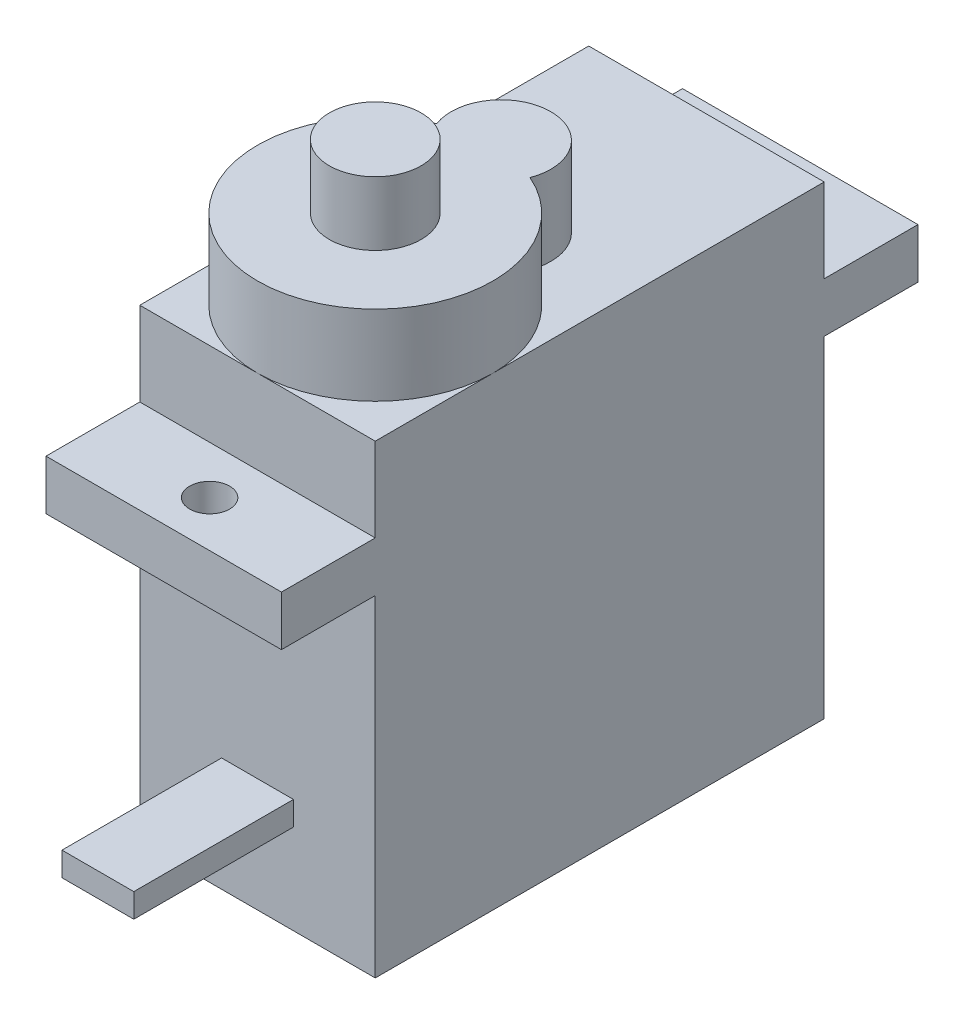
ISO-10303-21;
HEADER;
FILE_DESCRIPTION(('STEP AP214'),'2;1');
FILE_NAME('part.step','',(''),(''),'','','');
FILE_SCHEMA(('AUTOMOTIVE_DESIGN { 1 0 10303 214 1 1 1 1 }'));
ENDSEC;
DATA;
#1=APPLICATION_CONTEXT('core data for automotive mechanical design processes');
#2=APPLICATION_PROTOCOL_DEFINITION('international standard','automotive_design',2000,#1);
#3=PRODUCT_CONTEXT('',#1,'mechanical');
#4=PRODUCT('Part','Part','',(#3));
#5=PRODUCT_RELATED_PRODUCT_CATEGORY('part','',(#4));
#6=PRODUCT_DEFINITION_FORMATION('','',#4);
#7=PRODUCT_DEFINITION_CONTEXT('part definition',#1,'design');
#8=PRODUCT_DEFINITION('design','',#6,#7);
#9=PRODUCT_DEFINITION_SHAPE('','',#8);
#10=(LENGTH_UNIT() NAMED_UNIT(*) SI_UNIT(.MILLI.,.METRE.));
#11=(NAMED_UNIT(*) PLANE_ANGLE_UNIT() SI_UNIT($,.RADIAN.));
#12=(NAMED_UNIT(*) SI_UNIT($,.STERADIAN.) SOLID_ANGLE_UNIT());
#13=UNCERTAINTY_MEASURE_WITH_UNIT(LENGTH_MEASURE(1.E-05),#10,'distance_accuracy_value','');
#14=(GEOMETRIC_REPRESENTATION_CONTEXT(3) GLOBAL_UNCERTAINTY_ASSIGNED_CONTEXT((#13)) GLOBAL_UNIT_ASSIGNED_CONTEXT((#10,
#11,#12)) REPRESENTATION_CONTEXT('',''));
#15=CARTESIAN_POINT('',(0.,0.,0.));
#16=DIRECTION('',(0.,0.,1.));
#17=DIRECTION('',(1.,0.,0.));
#18=AXIS2_PLACEMENT_3D('',#15,#16,#17);
#19=CARTESIAN_POINT('',(-5.9,23.3,11.25));
#20=DIRECTION('',(0.,0.,-1.));
#21=DIRECTION('',(-1.,0.,0.));
#22=AXIS2_PLACEMENT_3D('',#19,#20,#21);
#23=PLANE('',#22);
#24=DIRECTION('',(1.,0.,0.));
#25=VECTOR('',#24,1.);
#26=CARTESIAN_POINT('',(-5.9,16.6,11.25));
#27=LINE('',#26,#25);
#28=CARTESIAN_POINT('',(-5.9,16.6,11.25));
#29=VERTEX_POINT('',#28);
#30=CARTESIAN_POINT('',(5.9,16.6,11.25));
#31=VERTEX_POINT('',#30);
#32=EDGE_CURVE('E322',#29,#31,#27,.T.);
#33=ORIENTED_EDGE('',*,*,#32,.F.);
#34=DIRECTION('',(0.,-1.,0.));
#35=VECTOR('',#34,1.);
#36=CARTESIAN_POINT('',(-5.9,23.3,11.25));
#37=LINE('',#36,#35);
#38=CARTESIAN_POINT('',(-5.9,0.,11.25));
#39=VERTEX_POINT('',#38);
#40=EDGE_CURVE('E312',#29,#39,#37,.T.);
#41=ORIENTED_EDGE('',*,*,#40,.T.);
#42=DIRECTION('',(1.,0.,0.));
#43=VECTOR('',#42,1.);
#44=CARTESIAN_POINT('',(-5.9,0.,11.25));
#45=LINE('',#44,#43);
#46=CARTESIAN_POINT('',(5.9,0.,11.25));
#47=VERTEX_POINT('',#46);
#48=EDGE_CURVE('E306',#39,#47,#45,.T.);
#49=ORIENTED_EDGE('',*,*,#48,.T.);
#50=DIRECTION('',(0.,-1.,0.));
#51=VECTOR('',#50,1.);
#52=CARTESIAN_POINT('',(5.9,23.3,11.25));
#53=LINE('',#52,#51);
#54=EDGE_CURVE('E297',#31,#47,#53,.T.);
#55=ORIENTED_EDGE('',*,*,#54,.F.);
#56=EDGE_LOOP('',(#33,#41,#49,#55));
#57=FACE_BOUND('',#56,.T.);
#58=DIRECTION('',(0.,1.,0.));
#59=VECTOR('',#58,1.);
#60=CARTESIAN_POINT('',(1.8,5.7,11.25));
#61=LINE('',#60,#59);
#62=CARTESIAN_POINT('',(1.8,4.5,11.25));
#63=VERTEX_POINT('',#62);
#64=CARTESIAN_POINT('',(1.8,5.7,11.25));
#65=VERTEX_POINT('',#64);
#66=EDGE_CURVE('E201',#63,#65,#61,.T.);
#67=ORIENTED_EDGE('',*,*,#66,.F.);
#68=DIRECTION('',(1.,0.,0.));
#69=VECTOR('',#68,1.);
#70=CARTESIAN_POINT('',(-1.8,4.5,11.25));
#71=LINE('',#70,#69);
#72=CARTESIAN_POINT('',(-1.8,4.5,11.25));
#73=VERTEX_POINT('',#72);
#74=EDGE_CURVE('E198',#73,#63,#71,.T.);
#75=ORIENTED_EDGE('',*,*,#74,.F.);
#76=DIRECTION('',(0.,-1.,0.));
#77=VECTOR('',#76,1.);
#78=CARTESIAN_POINT('',(-1.8,5.7,11.25));
#79=LINE('',#78,#77);
#80=CARTESIAN_POINT('',(-1.8,5.7,11.25));
#81=VERTEX_POINT('',#80);
#82=EDGE_CURVE('E67',#81,#73,#79,.T.);
#83=ORIENTED_EDGE('',*,*,#82,.F.);
#84=DIRECTION('',(-1.,0.,0.));
#85=VECTOR('',#84,1.);
#86=CARTESIAN_POINT('',(-1.8,5.7,11.25));
#87=LINE('',#86,#85);
#88=EDGE_CURVE('E62',#65,#81,#87,.T.);
#89=ORIENTED_EDGE('',*,*,#88,.F.);
#90=EDGE_LOOP('',(#67,#75,#83,#89));
#91=FACE_BOUND('',#90,.T.);
#92=ADVANCED_FACE('F44',(#57,#91),#23,.F.);
#93=CARTESIAN_POINT('',(0.,27.3,0.));
#94=DIRECTION('',(0.,1.,0.));
#95=DIRECTION('',(0.,0.,1.));
#96=AXIS2_PLACEMENT_3D('',#93,#94,#95);
#97=PLANE('',#96);
#98=CARTESIAN_POINT('',(0.,27.3,5.35));
#99=DIRECTION('',(0.,1.,0.));
#100=DIRECTION('',(0.,0.,1.));
#101=AXIS2_PLACEMENT_3D('',#98,#99,#100);
#102=CIRCLE('',#101,5.9);
#103=CARTESIAN_POINT('',(-2.3387437273507,27.3,-0.0666666666666706));
#104=VERTEX_POINT('',#103);
#105=CARTESIAN_POINT('',(2.3387437273507,27.3,-0.0666666666666706));
#106=VERTEX_POINT('',#105);
#107=EDGE_CURVE('E214',#104,#106,#102,.T.);
#108=ORIENTED_EDGE('',*,*,#107,.T.);
#109=CARTESIAN_POINT('',(0.,27.3,-0.950000000000002));
#110=DIRECTION('',(0.,1.,0.));
#111=DIRECTION('',(0.,0.,1.));
#112=AXIS2_PLACEMENT_3D('',#109,#110,#111);
#113=CIRCLE('',#112,2.5);
#114=EDGE_CURVE('E219',#106,#104,#113,.T.);
#115=ORIENTED_EDGE('',*,*,#114,.T.);
#116=EDGE_LOOP('',(#108,#115));
#117=FACE_BOUND('',#116,.T.);
#118=CARTESIAN_POINT('',(0.,27.3,5.35));
#119=DIRECTION('',(0.,1.,0.));
#120=DIRECTION('',(0.,0.,1.));
#121=AXIS2_PLACEMENT_3D('',#118,#119,#120);
#122=CIRCLE('',#121,2.3);
#123=CARTESIAN_POINT('',(0.,27.3,7.65));
#124=VERTEX_POINT('',#123);
#125=EDGE_CURVE('E202',#124,#124,#122,.T.);
#126=ORIENTED_EDGE('',*,*,#125,.F.);
#127=EDGE_LOOP('',(#126));
#128=FACE_BOUND('',#127,.T.);
#129=ADVANCED_FACE('F371',(#117,#128),#97,.T.);
#130=CARTESIAN_POINT('',(0.,23.3,0.));
#131=DIRECTION('',(0.,1.,0.));
#132=DIRECTION('',(0.,0.,1.));
#133=AXIS2_PLACEMENT_3D('',#130,#131,#132);
#134=PLANE('',#133);
#135=CARTESIAN_POINT('',(0.,23.3,5.35));
#136=DIRECTION('',(0.,1.,0.));
#137=DIRECTION('',(0.,0.,1.));
#138=AXIS2_PLACEMENT_3D('',#135,#136,#137);
#139=CIRCLE('',#138,5.9);
#140=CARTESIAN_POINT('',(-2.3387437273507,23.3,-0.0666666666666706));
#141=VERTEX_POINT('',#140);
#142=CARTESIAN_POINT('',(-5.9,23.3,5.35));
#143=VERTEX_POINT('',#142);
#144=EDGE_CURVE('E55',#141,#143,#139,.T.);
#145=ORIENTED_EDGE('',*,*,#144,.F.);
#146=CARTESIAN_POINT('',(0.,23.3,-0.950000000000002));
#147=DIRECTION('',(0.,1.,0.));
#148=DIRECTION('',(0.,0.,1.));
#149=AXIS2_PLACEMENT_3D('',#146,#147,#148);
#150=CIRCLE('',#149,2.5);
#151=CARTESIAN_POINT('',(2.3387437273507,23.3,-0.0666666666666706));
#152=VERTEX_POINT('',#151);
#153=EDGE_CURVE('E212',#152,#141,#150,.T.);
#154=ORIENTED_EDGE('',*,*,#153,.F.);
#155=CARTESIAN_POINT('',(5.9,23.3,5.35));
#156=VERTEX_POINT('',#155);
#157=EDGE_CURVE('E220',#156,#152,#139,.T.);
#158=ORIENTED_EDGE('',*,*,#157,.F.);
#159=DIRECTION('',(0.,0.,-1.));
#160=VECTOR('',#159,1.);
#161=CARTESIAN_POINT('',(5.9,23.3,-11.25));
#162=LINE('',#161,#160);
#163=CARTESIAN_POINT('',(5.9,23.3,-11.25));
#164=VERTEX_POINT('',#163);
#165=EDGE_CURVE('E287',#156,#164,#162,.T.);
#166=ORIENTED_EDGE('',*,*,#165,.T.);
#167=DIRECTION('',(-1.,0.,0.));
#168=VECTOR('',#167,1.);
#169=CARTESIAN_POINT('',(-5.9,23.3,-11.25));
#170=LINE('',#169,#168);
#171=CARTESIAN_POINT('',(-5.9,23.3,-11.25));
#172=VERTEX_POINT('',#171);
#173=EDGE_CURVE('E286',#164,#172,#170,.T.);
#174=ORIENTED_EDGE('',*,*,#173,.T.);
#175=DIRECTION('',(0.,0.,1.));
#176=VECTOR('',#175,1.);
#177=CARTESIAN_POINT('',(-5.9,23.3,-11.25));
#178=LINE('',#177,#176);
#179=EDGE_CURVE('E290',#172,#143,#178,.T.);
#180=ORIENTED_EDGE('',*,*,#179,.T.);
#181=EDGE_LOOP('',(#145,#154,#158,#166,#174,#180));
#182=FACE_BOUND('',#181,.T.);
#183=ADVANCED_FACE('F361',(#182),#134,.T.);
#184=CARTESIAN_POINT('',(0.,23.3,11.25));
#185=VERTEX_POINT('',#184);
#186=EDGE_CURVE('E12',#143,#185,#139,.T.);
#187=ORIENTED_EDGE('',*,*,#186,.F.);
#188=CARTESIAN_POINT('',(-5.9,23.3,11.25));
#189=VERTEX_POINT('',#188);
#190=EDGE_CURVE('E289',#143,#189,#178,.T.);
#191=ORIENTED_EDGE('',*,*,#190,.T.);
#192=DIRECTION('',(1.,0.,0.));
#193=VECTOR('',#192,1.);
#194=CARTESIAN_POINT('',(-5.9,23.3,11.25));
#195=LINE('',#194,#193);
#196=EDGE_CURVE('E294',#189,#185,#195,.T.);
#197=ORIENTED_EDGE('',*,*,#196,.T.);
#198=EDGE_LOOP('',(#187,#191,#197));
#199=FACE_BOUND('',#198,.T.);
#200=ADVANCED_FACE('F342',(#199),#134,.T.);
#201=CARTESIAN_POINT('',(-5.9,23.3,-11.25));
#202=DIRECTION('',(0.,0.,1.));
#203=DIRECTION('',(1.,0.,0.));
#204=AXIS2_PLACEMENT_3D('',#201,#202,#203);
#205=PLANE('',#204);
#206=DIRECTION('',(-1.,0.,0.));
#207=VECTOR('',#206,1.);
#208=CARTESIAN_POINT('',(-5.9,16.6,-11.25));
#209=LINE('',#208,#207);
#210=CARTESIAN_POINT('',(5.9,16.6,-11.25));
#211=VERTEX_POINT('',#210);
#212=CARTESIAN_POINT('',(-5.9,16.6,-11.25));
#213=VERTEX_POINT('',#212);
#214=EDGE_CURVE('E276',#211,#213,#209,.T.);
#215=ORIENTED_EDGE('',*,*,#214,.F.);
#216=DIRECTION('',(0.,-1.,0.));
#217=VECTOR('',#216,1.);
#218=CARTESIAN_POINT('',(5.9,23.3,-11.25));
#219=LINE('',#218,#217);
#220=CARTESIAN_POINT('',(5.9,0.,-11.25));
#221=VERTEX_POINT('',#220);
#222=EDGE_CURVE('E319',#211,#221,#219,.T.);
#223=ORIENTED_EDGE('',*,*,#222,.T.);
#224=DIRECTION('',(-1.,0.,0.));
#225=VECTOR('',#224,1.);
#226=CARTESIAN_POINT('',(-5.9,0.,-11.25));
#227=LINE('',#226,#225);
#228=CARTESIAN_POINT('',(-5.9,0.,-11.25));
#229=VERTEX_POINT('',#228);
#230=EDGE_CURVE('E300',#221,#229,#227,.T.);
#231=ORIENTED_EDGE('',*,*,#230,.T.);
#232=DIRECTION('',(0.,-1.,0.));
#233=VECTOR('',#232,1.);
#234=CARTESIAN_POINT('',(-5.9,23.3,-11.25));
#235=LINE('',#234,#233);
#236=EDGE_CURVE('E315',#213,#229,#235,.T.);
#237=ORIENTED_EDGE('',*,*,#236,.F.);
#238=EDGE_LOOP('',(#215,#223,#231,#237));
#239=FACE_BOUND('',#238,.T.);
#240=ADVANCED_FACE('F407',(#239),#205,.F.);
#241=CARTESIAN_POINT('',(5.9,23.3,-11.25));
#242=DIRECTION('',(-1.,0.,0.));
#243=DIRECTION('',(0.,0.,1.));
#244=AXIS2_PLACEMENT_3D('',#241,#242,#243);
#245=PLANE('',#244);
#246=CARTESIAN_POINT('',(5.9,23.3,11.25));
#247=VERTEX_POINT('',#246);
#248=CARTESIAN_POINT('',(5.9,19.1,11.25));
#249=VERTEX_POINT('',#248);
#250=EDGE_CURVE('E309',#247,#249,#53,.T.);
#251=ORIENTED_EDGE('',*,*,#250,.T.);
#252=DIRECTION('',(0.,0.,-1.));
#253=VECTOR('',#252,1.);
#254=CARTESIAN_POINT('',(5.9,19.1,-15.95));
#255=LINE('',#254,#253);
#256=CARTESIAN_POINT('',(5.9,19.1,15.95));
#257=VERTEX_POINT('',#256);
#258=EDGE_CURVE('E243',#257,#249,#255,.T.);
#259=ORIENTED_EDGE('',*,*,#258,.F.);
#260=DIRECTION('',(0.,-1.,0.));
#261=VECTOR('',#260,1.);
#262=CARTESIAN_POINT('',(5.9,19.1,15.95));
#263=LINE('',#262,#261);
#264=CARTESIAN_POINT('',(5.9,16.6,15.95));
#265=VERTEX_POINT('',#264);
#266=EDGE_CURVE('E254',#257,#265,#263,.T.);
#267=ORIENTED_EDGE('',*,*,#266,.T.);
#268=DIRECTION('',(0.,0.,-1.));
#269=VECTOR('',#268,1.);
#270=CARTESIAN_POINT('',(5.9,16.6,-15.95));
#271=LINE('',#270,#269);
#272=EDGE_CURVE('E255',#265,#31,#271,.T.);
#273=ORIENTED_EDGE('',*,*,#272,.T.);
#274=ORIENTED_EDGE('',*,*,#54,.T.);
#275=DIRECTION('',(0.,0.,-1.));
#276=VECTOR('',#275,1.);
#277=CARTESIAN_POINT('',(5.9,0.,-11.25));
#278=LINE('',#277,#276);
#279=EDGE_CURVE('E282',#47,#221,#278,.T.);
#280=ORIENTED_EDGE('',*,*,#279,.T.);
#281=ORIENTED_EDGE('',*,*,#222,.F.);
#282=CARTESIAN_POINT('',(5.9,16.6,-15.95));
#283=VERTEX_POINT('',#282);
#284=EDGE_CURVE('E240',#211,#283,#271,.T.);
#285=ORIENTED_EDGE('',*,*,#284,.T.);
#286=DIRECTION('',(0.,-1.,0.));
#287=VECTOR('',#286,1.);
#288=CARTESIAN_POINT('',(5.9,19.1,-15.95));
#289=LINE('',#288,#287);
#290=CARTESIAN_POINT('',(5.9,19.1,-15.95));
#291=VERTEX_POINT('',#290);
#292=EDGE_CURVE('E273',#291,#283,#289,.T.);
#293=ORIENTED_EDGE('',*,*,#292,.F.);
#294=CARTESIAN_POINT('',(5.9,19.1,-11.25));
#295=VERTEX_POINT('',#294);
#296=EDGE_CURVE('E247',#295,#291,#255,.T.);
#297=ORIENTED_EDGE('',*,*,#296,.F.);
#298=EDGE_CURVE('E320',#164,#295,#219,.T.);
#299=ORIENTED_EDGE('',*,*,#298,.F.);
#300=ORIENTED_EDGE('',*,*,#165,.F.);
#301=EDGE_CURVE('E283',#247,#156,#162,.T.);
#302=ORIENTED_EDGE('',*,*,#301,.F.);
#303=EDGE_LOOP('',(#251,#259,#267,#273,#274,#280,#281,#285,#293,#297,#299,#300,#302));
#304=FACE_BOUND('',#303,.T.);
#305=ADVANCED_FACE('F46',(#304),#245,.F.);
#306=ORIENTED_EDGE('',*,*,#298,.T.);
#307=DIRECTION('',(-1.,0.,0.));
#308=VECTOR('',#307,1.);
#309=CARTESIAN_POINT('',(-5.9,19.1,-11.25));
#310=LINE('',#309,#308);
#311=CARTESIAN_POINT('',(-5.9,19.1,-11.25));
#312=VERTEX_POINT('',#311);
#313=EDGE_CURVE('E279',#295,#312,#310,.T.);
#314=ORIENTED_EDGE('',*,*,#313,.T.);
#315=EDGE_CURVE('E316',#172,#312,#235,.T.);
#316=ORIENTED_EDGE('',*,*,#315,.F.);
#317=ORIENTED_EDGE('',*,*,#173,.F.);
#318=EDGE_LOOP('',(#306,#314,#316,#317));
#319=FACE_BOUND('',#318,.T.);
#320=ADVANCED_FACE('F364',(#319),#205,.F.);
#321=CARTESIAN_POINT('',(-5.9,23.3,-11.25));
#322=DIRECTION('',(1.,0.,0.));
#323=DIRECTION('',(0.,0.,-1.));
#324=AXIS2_PLACEMENT_3D('',#321,#322,#323);
#325=PLANE('',#324);
#326=ORIENTED_EDGE('',*,*,#315,.T.);
#327=DIRECTION('',(0.,0.,1.));
#328=VECTOR('',#327,1.);
#329=CARTESIAN_POINT('',(-5.9,19.1,-15.95));
#330=LINE('',#329,#328);
#331=CARTESIAN_POINT('',(-5.9,19.1,-15.95));
#332=VERTEX_POINT('',#331);
#333=EDGE_CURVE('E250',#332,#312,#330,.T.);
#334=ORIENTED_EDGE('',*,*,#333,.F.);
#335=DIRECTION('',(0.,-1.,0.));
#336=VECTOR('',#335,1.);
#337=CARTESIAN_POINT('',(-5.9,19.1,-15.95));
#338=LINE('',#337,#336);
#339=CARTESIAN_POINT('',(-5.9,16.6,-15.95));
#340=VERTEX_POINT('',#339);
#341=EDGE_CURVE('E270',#332,#340,#338,.T.);
#342=ORIENTED_EDGE('',*,*,#341,.T.);
#343=DIRECTION('',(0.,0.,1.));
#344=VECTOR('',#343,1.);
#345=CARTESIAN_POINT('',(-5.9,16.6,-15.95));
#346=LINE('',#345,#344);
#347=EDGE_CURVE('E261',#340,#213,#346,.T.);
#348=ORIENTED_EDGE('',*,*,#347,.T.);
#349=ORIENTED_EDGE('',*,*,#236,.T.);
#350=DIRECTION('',(0.,0.,1.));
#351=VECTOR('',#350,1.);
#352=CARTESIAN_POINT('',(-5.9,0.,-11.25));
#353=LINE('',#352,#351);
#354=EDGE_CURVE('E303',#229,#39,#353,.T.);
#355=ORIENTED_EDGE('',*,*,#354,.T.);
#356=ORIENTED_EDGE('',*,*,#40,.F.);
#357=CARTESIAN_POINT('',(-5.9,16.6,15.95));
#358=VERTEX_POINT('',#357);
#359=EDGE_CURVE('E260',#29,#358,#346,.T.);
#360=ORIENTED_EDGE('',*,*,#359,.T.);
#361=DIRECTION('',(0.,-1.,0.));
#362=VECTOR('',#361,1.);
#363=CARTESIAN_POINT('',(-5.9,19.1,15.95));
#364=LINE('',#363,#362);
#365=CARTESIAN_POINT('',(-5.9,19.1,15.95));
#366=VERTEX_POINT('',#365);
#367=EDGE_CURVE('E267',#366,#358,#364,.T.);
#368=ORIENTED_EDGE('',*,*,#367,.F.);
#369=CARTESIAN_POINT('',(-5.9,19.1,11.25));
#370=VERTEX_POINT('',#369);
#371=EDGE_CURVE('E249',#370,#366,#330,.T.);
#372=ORIENTED_EDGE('',*,*,#371,.F.);
#373=EDGE_CURVE('E313',#189,#370,#37,.T.);
#374=ORIENTED_EDGE('',*,*,#373,.F.);
#375=ORIENTED_EDGE('',*,*,#190,.F.);
#376=ORIENTED_EDGE('',*,*,#179,.F.);
#377=EDGE_LOOP('',(#326,#334,#342,#348,#349,#355,#356,#360,#368,#372,#374,#375,#376));
#378=FACE_BOUND('',#377,.T.);
#379=ADVANCED_FACE('F348',(#378),#325,.F.);
#380=ORIENTED_EDGE('',*,*,#373,.T.);
#381=DIRECTION('',(1.,0.,0.));
#382=VECTOR('',#381,1.);
#383=CARTESIAN_POINT('',(-5.9,19.1,11.25));
#384=LINE('',#383,#382);
#385=EDGE_CURVE('E48',#370,#249,#384,.T.);
#386=ORIENTED_EDGE('',*,*,#385,.T.);
#387=ORIENTED_EDGE('',*,*,#250,.F.);
#388=EDGE_CURVE('E293',#185,#247,#195,.T.);
#389=ORIENTED_EDGE('',*,*,#388,.F.);
#390=ORIENTED_EDGE('',*,*,#196,.F.);
#391=EDGE_LOOP('',(#380,#386,#387,#389,#390));
#392=FACE_BOUND('',#391,.T.);
#393=ADVANCED_FACE('F340',(#392),#23,.F.);
#394=EDGE_CURVE('E53',#185,#156,#139,.T.);
#395=ORIENTED_EDGE('',*,*,#394,.F.);
#396=ORIENTED_EDGE('',*,*,#388,.T.);
#397=ORIENTED_EDGE('',*,*,#301,.T.);
#398=EDGE_LOOP('',(#395,#396,#397));
#399=FACE_BOUND('',#398,.T.);
#400=ADVANCED_FACE('F337',(#399),#134,.T.);
#401=CARTESIAN_POINT('',(0.,0.,0.));
#402=DIRECTION('',(0.,1.,0.));
#403=DIRECTION('',(0.,0.,1.));
#404=AXIS2_PLACEMENT_3D('',#401,#402,#403);
#405=PLANE('',#404);
#406=ORIENTED_EDGE('',*,*,#279,.F.);
#407=ORIENTED_EDGE('',*,*,#48,.F.);
#408=ORIENTED_EDGE('',*,*,#354,.F.);
#409=ORIENTED_EDGE('',*,*,#230,.F.);
#410=EDGE_LOOP('',(#406,#407,#408,#409));
#411=FACE_BOUND('',#410,.T.);
#412=ADVANCED_FACE('F402',(#411),#405,.F.);
#413=CARTESIAN_POINT('',(0.,19.1,13.65));
#414=DIRECTION('',(0.,-1.,0.));
#415=DIRECTION('',(0.,0.,-1.));
#416=AXIS2_PLACEMENT_3D('',#413,#414,#415);
#417=CYLINDRICAL_SURFACE('',#416,1.);
#418=CARTESIAN_POINT('',(0.,19.1,13.65));
#419=DIRECTION('',(0.,1.,0.));
#420=DIRECTION('',(0.,0.,-1.));
#421=AXIS2_PLACEMENT_3D('',#418,#419,#420);
#422=CIRCLE('',#421,1.);
#423=CARTESIAN_POINT('',(0.,19.1,12.65));
#424=VERTEX_POINT('',#423);
#425=EDGE_CURVE('E231',#424,#424,#422,.T.);
#426=ORIENTED_EDGE('',*,*,#425,.T.);
#427=EDGE_LOOP('',(#426));
#428=FACE_BOUND('',#427,.T.);
#429=CARTESIAN_POINT('',(0.,16.6,13.65));
#430=DIRECTION('',(0.,1.,0.));
#431=DIRECTION('',(0.,0.,-1.));
#432=AXIS2_PLACEMENT_3D('',#429,#430,#431);
#433=CIRCLE('',#432,1.);
#434=CARTESIAN_POINT('',(0.,16.6,12.65));
#435=VERTEX_POINT('',#434);
#436=EDGE_CURVE('E226',#435,#435,#433,.T.);
#437=ORIENTED_EDGE('',*,*,#436,.F.);
#438=EDGE_LOOP('',(#437));
#439=FACE_BOUND('',#438,.T.);
#440=ADVANCED_FACE('F454',(#428,#439),#417,.F.);
#441=CARTESIAN_POINT('',(-5.9,19.1,15.95));
#442=DIRECTION('',(0.,0.,-1.));
#443=DIRECTION('',(-1.,0.,0.));
#444=AXIS2_PLACEMENT_3D('',#441,#442,#443);
#445=PLANE('',#444);
#446=DIRECTION('',(1.,0.,0.));
#447=VECTOR('',#446,1.);
#448=CARTESIAN_POINT('',(-5.9,16.6,15.95));
#449=LINE('',#448,#447);
#450=EDGE_CURVE('E263',#358,#265,#449,.T.);
#451=ORIENTED_EDGE('',*,*,#450,.T.);
#452=ORIENTED_EDGE('',*,*,#266,.F.);
#453=DIRECTION('',(1.,0.,0.));
#454=VECTOR('',#453,1.);
#455=CARTESIAN_POINT('',(-5.9,19.1,15.95));
#456=LINE('',#455,#454);
#457=EDGE_CURVE('E252',#366,#257,#456,.T.);
#458=ORIENTED_EDGE('',*,*,#457,.F.);
#459=ORIENTED_EDGE('',*,*,#367,.T.);
#460=EDGE_LOOP('',(#451,#452,#458,#459));
#461=FACE_BOUND('',#460,.T.);
#462=ADVANCED_FACE('F451',(#461),#445,.F.);
#463=CARTESIAN_POINT('',(0.,16.6,0.));
#464=DIRECTION('',(0.,1.,0.));
#465=DIRECTION('',(0.,0.,1.));
#466=AXIS2_PLACEMENT_3D('',#463,#464,#465);
#467=PLANE('',#466);
#468=ORIENTED_EDGE('',*,*,#436,.T.);
#469=EDGE_LOOP('',(#468));
#470=FACE_BOUND('',#469,.T.);
#471=ORIENTED_EDGE('',*,*,#359,.F.);
#472=ORIENTED_EDGE('',*,*,#32,.T.);
#473=ORIENTED_EDGE('',*,*,#272,.F.);
#474=ORIENTED_EDGE('',*,*,#450,.F.);
#475=EDGE_LOOP('',(#471,#472,#473,#474));
#476=FACE_BOUND('',#475,.T.);
#477=ADVANCED_FACE('F444',(#470,#476),#467,.F.);
#478=CARTESIAN_POINT('',(0.,19.1,0.));
#479=DIRECTION('',(0.,1.,0.));
#480=DIRECTION('',(0.,0.,1.));
#481=AXIS2_PLACEMENT_3D('',#478,#479,#480);
#482=PLANE('',#481);
#483=ORIENTED_EDGE('',*,*,#425,.F.);
#484=EDGE_LOOP('',(#483));
#485=FACE_BOUND('',#484,.T.);
#486=ORIENTED_EDGE('',*,*,#385,.F.);
#487=ORIENTED_EDGE('',*,*,#371,.T.);
#488=ORIENTED_EDGE('',*,*,#457,.T.);
#489=ORIENTED_EDGE('',*,*,#258,.T.);
#490=EDGE_LOOP('',(#486,#487,#488,#489));
#491=FACE_BOUND('',#490,.T.);
#492=ADVANCED_FACE('F351',(#485,#491),#482,.T.);
#493=CARTESIAN_POINT('',(0.,19.1,-13.65));
#494=DIRECTION('',(0.,1.,0.));
#495=DIRECTION('',(0.,0.,1.));
#496=AXIS2_PLACEMENT_3D('',#493,#494,#495);
#497=CIRCLE('',#496,1.);
#498=CARTESIAN_POINT('',(0.,19.1,-12.65));
#499=VERTEX_POINT('',#498);
#500=EDGE_CURVE('E237',#499,#499,#497,.T.);
#501=ORIENTED_EDGE('',*,*,#500,.F.);
#502=EDGE_LOOP('',(#501));
#503=FACE_BOUND('',#502,.T.);
#504=ORIENTED_EDGE('',*,*,#313,.F.);
#505=ORIENTED_EDGE('',*,*,#296,.T.);
#506=DIRECTION('',(-1.,0.,0.));
#507=VECTOR('',#506,1.);
#508=CARTESIAN_POINT('',(-5.9,19.1,-15.95));
#509=LINE('',#508,#507);
#510=EDGE_CURVE('E246',#291,#332,#509,.T.);
#511=ORIENTED_EDGE('',*,*,#510,.T.);
#512=ORIENTED_EDGE('',*,*,#333,.T.);
#513=EDGE_LOOP('',(#504,#505,#511,#512));
#514=FACE_BOUND('',#513,.T.);
#515=ADVANCED_FACE('F434',(#503,#514),#482,.T.);
#516=CARTESIAN_POINT('',(0.,16.6,-13.65));
#517=DIRECTION('',(0.,1.,0.));
#518=DIRECTION('',(0.,0.,1.));
#519=AXIS2_PLACEMENT_3D('',#516,#517,#518);
#520=CIRCLE('',#519,1.);
#521=CARTESIAN_POINT('',(0.,16.6,-12.65));
#522=VERTEX_POINT('',#521);
#523=EDGE_CURVE('E234',#522,#522,#520,.T.);
#524=ORIENTED_EDGE('',*,*,#523,.T.);
#525=EDGE_LOOP('',(#524));
#526=FACE_BOUND('',#525,.T.);
#527=ORIENTED_EDGE('',*,*,#284,.F.);
#528=ORIENTED_EDGE('',*,*,#214,.T.);
#529=ORIENTED_EDGE('',*,*,#347,.F.);
#530=DIRECTION('',(-1.,0.,0.));
#531=VECTOR('',#530,1.);
#532=CARTESIAN_POINT('',(-5.9,16.6,-15.95));
#533=LINE('',#532,#531);
#534=EDGE_CURVE('E258',#283,#340,#533,.T.);
#535=ORIENTED_EDGE('',*,*,#534,.F.);
#536=EDGE_LOOP('',(#527,#528,#529,#535));
#537=FACE_BOUND('',#536,.T.);
#538=ADVANCED_FACE('F429',(#526,#537),#467,.F.);
#539=CARTESIAN_POINT('',(-5.9,19.1,-15.95));
#540=DIRECTION('',(0.,0.,1.));
#541=DIRECTION('',(1.,0.,0.));
#542=AXIS2_PLACEMENT_3D('',#539,#540,#541);
#543=PLANE('',#542);
#544=ORIENTED_EDGE('',*,*,#534,.T.);
#545=ORIENTED_EDGE('',*,*,#341,.F.);
#546=ORIENTED_EDGE('',*,*,#510,.F.);
#547=ORIENTED_EDGE('',*,*,#292,.T.);
#548=EDGE_LOOP('',(#544,#545,#546,#547));
#549=FACE_BOUND('',#548,.T.);
#550=ADVANCED_FACE('F432',(#549),#543,.F.);
#551=CARTESIAN_POINT('',(0.,19.1,-13.65));
#552=DIRECTION('',(0.,-1.,0.));
#553=DIRECTION('',(0.,0.,-1.));
#554=AXIS2_PLACEMENT_3D('',#551,#552,#553);
#555=CYLINDRICAL_SURFACE('',#554,1.);
#556=ORIENTED_EDGE('',*,*,#500,.T.);
#557=EDGE_LOOP('',(#556));
#558=FACE_BOUND('',#557,.T.);
#559=ORIENTED_EDGE('',*,*,#523,.F.);
#560=EDGE_LOOP('',(#559));
#561=FACE_BOUND('',#560,.T.);
#562=ADVANCED_FACE('F448',(#558,#561),#555,.F.);
#563=CARTESIAN_POINT('',(0.,27.3,5.35));
#564=DIRECTION('',(0.,-1.,0.));
#565=DIRECTION('',(0.,0.,-1.));
#566=AXIS2_PLACEMENT_3D('',#563,#564,#565);
#567=CYLINDRICAL_SURFACE('',#566,5.9);
#568=ORIENTED_EDGE('',*,*,#144,.T.);
#569=ORIENTED_EDGE('',*,*,#186,.T.);
#570=ORIENTED_EDGE('',*,*,#394,.T.);
#571=ORIENTED_EDGE('',*,*,#157,.T.);
#572=DIRECTION('',(0.,-1.,0.));
#573=VECTOR('',#572,1.);
#574=CARTESIAN_POINT('',(2.3387437273507,27.3,-0.0666666666666706));
#575=LINE('',#574,#573);
#576=EDGE_CURVE('E223',#106,#152,#575,.T.);
#577=ORIENTED_EDGE('',*,*,#576,.F.);
#578=ORIENTED_EDGE('',*,*,#107,.F.);
#579=DIRECTION('',(0.,-1.,0.));
#580=VECTOR('',#579,1.);
#581=CARTESIAN_POINT('',(-2.3387437273507,27.3,-0.0666666666666706));
#582=LINE('',#581,#580);
#583=EDGE_CURVE('E216',#104,#141,#582,.T.);
#584=ORIENTED_EDGE('',*,*,#583,.T.);
#585=EDGE_LOOP('',(#568,#569,#570,#571,#577,#578,#584));
#586=FACE_BOUND('',#585,.T.);
#587=ADVANCED_FACE('F334',(#586),#567,.T.);
#588=CARTESIAN_POINT('',(0.,27.3,-0.950000000000002));
#589=DIRECTION('',(0.,-1.,0.));
#590=DIRECTION('',(0.,0.,-1.));
#591=AXIS2_PLACEMENT_3D('',#588,#589,#590);
#592=CYLINDRICAL_SURFACE('',#591,2.5);
#593=ORIENTED_EDGE('',*,*,#114,.F.);
#594=ORIENTED_EDGE('',*,*,#576,.T.);
#595=ORIENTED_EDGE('',*,*,#153,.T.);
#596=ORIENTED_EDGE('',*,*,#583,.F.);
#597=EDGE_LOOP('',(#593,#594,#595,#596));
#598=FACE_BOUND('',#597,.T.);
#599=ADVANCED_FACE('F369',(#598),#592,.T.);
#600=CARTESIAN_POINT('',(0.,30.5,5.35));
#601=DIRECTION('',(0.,-1.,0.));
#602=DIRECTION('',(0.,0.,-1.));
#603=AXIS2_PLACEMENT_3D('',#600,#601,#602);
#604=CYLINDRICAL_SURFACE('',#603,2.3);
#605=CARTESIAN_POINT('',(0.,30.5,5.35));
#606=DIRECTION('',(0.,1.,0.));
#607=DIRECTION('',(0.,0.,1.));
#608=AXIS2_PLACEMENT_3D('',#605,#606,#607);
#609=CIRCLE('',#608,2.3);
#610=CARTESIAN_POINT('',(0.,30.5,7.65));
#611=VERTEX_POINT('',#610);
#612=EDGE_CURVE('E205',#611,#611,#609,.T.);
#613=ORIENTED_EDGE('',*,*,#612,.F.);
#614=EDGE_LOOP('',(#613));
#615=FACE_BOUND('',#614,.T.);
#616=ORIENTED_EDGE('',*,*,#125,.T.);
#617=EDGE_LOOP('',(#616));
#618=FACE_BOUND('',#617,.T.);
#619=ADVANCED_FACE('F377',(#615,#618),#604,.T.);
#620=CARTESIAN_POINT('',(0.,30.5,5.35));
#621=DIRECTION('',(0.,1.,0.));
#622=DIRECTION('',(0.,0.,1.));
#623=AXIS2_PLACEMENT_3D('',#620,#621,#622);
#624=PLANE('',#623);
#625=ORIENTED_EDGE('',*,*,#612,.T.);
#626=EDGE_LOOP('',(#625));
#627=FACE_BOUND('',#626,.T.);
#628=ADVANCED_FACE('F379',(#627),#624,.T.);
#629=CARTESIAN_POINT('',(1.8,5.7,19.25));
#630=DIRECTION('',(-1.,0.,0.));
#631=DIRECTION('',(0.,0.,1.));
#632=AXIS2_PLACEMENT_3D('',#629,#630,#631);
#633=PLANE('',#632);
#634=ORIENTED_EDGE('',*,*,#66,.T.);
#635=DIRECTION('',(0.,0.,-1.));
#636=VECTOR('',#635,1.);
#637=CARTESIAN_POINT('',(1.8,5.7,19.25));
#638=LINE('',#637,#636);
#639=CARTESIAN_POINT('',(1.8,5.7,19.25));
#640=VERTEX_POINT('',#639);
#641=EDGE_CURVE('E182',#640,#65,#638,.T.);
#642=ORIENTED_EDGE('',*,*,#641,.F.);
#643=DIRECTION('',(0.,1.,0.));
#644=VECTOR('',#643,1.);
#645=CARTESIAN_POINT('',(1.8,5.7,19.25));
#646=LINE('',#645,#644);
#647=CARTESIAN_POINT('',(1.8,4.5,19.25));
#648=VERTEX_POINT('',#647);
#649=EDGE_CURVE('E189',#648,#640,#646,.T.);
#650=ORIENTED_EDGE('',*,*,#649,.F.);
#651=DIRECTION('',(0.,0.,-1.));
#652=VECTOR('',#651,1.);
#653=CARTESIAN_POINT('',(1.8,4.5,19.25));
#654=LINE('',#653,#652);
#655=EDGE_CURVE('E636',#648,#63,#654,.T.);
#656=ORIENTED_EDGE('',*,*,#655,.T.);
#657=EDGE_LOOP('',(#634,#642,#650,#656));
#658=FACE_BOUND('',#657,.T.);
#659=ADVANCED_FACE('F200',(#658),#633,.F.);
#660=CARTESIAN_POINT('',(-1.8,5.7,19.25));
#661=DIRECTION('',(0.,-1.,0.));
#662=DIRECTION('',(0.,0.,-1.));
#663=AXIS2_PLACEMENT_3D('',#660,#661,#662);
#664=PLANE('',#663);
#665=ORIENTED_EDGE('',*,*,#88,.T.);
#666=DIRECTION('',(0.,0.,-1.));
#667=VECTOR('',#666,1.);
#668=CARTESIAN_POINT('',(-1.8,5.7,19.25));
#669=LINE('',#668,#667);
#670=CARTESIAN_POINT('',(-1.8,5.7,19.25));
#671=VERTEX_POINT('',#670);
#672=EDGE_CURVE('E185',#671,#81,#669,.T.);
#673=ORIENTED_EDGE('',*,*,#672,.F.);
#674=DIRECTION('',(-1.,0.,0.));
#675=VECTOR('',#674,1.);
#676=CARTESIAN_POINT('',(-1.8,5.7,19.25));
#677=LINE('',#676,#675);
#678=EDGE_CURVE('E178',#640,#671,#677,.T.);
#679=ORIENTED_EDGE('',*,*,#678,.F.);
#680=ORIENTED_EDGE('',*,*,#641,.T.);
#681=EDGE_LOOP('',(#665,#673,#679,#680));
#682=FACE_BOUND('',#681,.T.);
#683=ADVANCED_FACE('F180',(#682),#664,.F.);
#684=CARTESIAN_POINT('',(-1.8,5.7,19.25));
#685=DIRECTION('',(1.,0.,0.));
#686=DIRECTION('',(0.,1.,0.));
#687=AXIS2_PLACEMENT_3D('',#684,#685,#686);
#688=PLANE('',#687);
#689=ORIENTED_EDGE('',*,*,#82,.T.);
#690=DIRECTION('',(0.,0.,-1.));
#691=VECTOR('',#690,1.);
#692=CARTESIAN_POINT('',(-1.8,4.5,19.25));
#693=LINE('',#692,#691);
#694=CARTESIAN_POINT('',(-1.8,4.5,19.25));
#695=VERTEX_POINT('',#694);
#696=EDGE_CURVE('E207',#695,#73,#693,.T.);
#697=ORIENTED_EDGE('',*,*,#696,.F.);
#698=DIRECTION('',(0.,-1.,0.));
#699=VECTOR('',#698,1.);
#700=CARTESIAN_POINT('',(-1.8,5.7,19.25));
#701=LINE('',#700,#699);
#702=EDGE_CURVE('E188',#671,#695,#701,.T.);
#703=ORIENTED_EDGE('',*,*,#702,.F.);
#704=ORIENTED_EDGE('',*,*,#672,.T.);
#705=EDGE_LOOP('',(#689,#697,#703,#704));
#706=FACE_BOUND('',#705,.T.);
#707=ADVANCED_FACE('F603',(#706),#688,.F.);
#708=CARTESIAN_POINT('',(-1.8,4.5,19.25));
#709=DIRECTION('',(0.,1.,0.));
#710=DIRECTION('',(0.,0.,1.));
#711=AXIS2_PLACEMENT_3D('',#708,#709,#710);
#712=PLANE('',#711);
#713=ORIENTED_EDGE('',*,*,#74,.T.);
#714=ORIENTED_EDGE('',*,*,#655,.F.);
#715=DIRECTION('',(1.,0.,0.));
#716=VECTOR('',#715,1.);
#717=CARTESIAN_POINT('',(-1.8,4.5,19.25));
#718=LINE('',#717,#716);
#719=EDGE_CURVE('E194',#695,#648,#718,.T.);
#720=ORIENTED_EDGE('',*,*,#719,.F.);
#721=ORIENTED_EDGE('',*,*,#696,.T.);
#722=EDGE_LOOP('',(#713,#714,#720,#721));
#723=FACE_BOUND('',#722,.T.);
#724=ADVANCED_FACE('F612',(#723),#712,.F.);
#725=CARTESIAN_POINT('',(0.,0.,19.25));
#726=DIRECTION('',(0.,0.,1.));
#727=DIRECTION('',(1.,0.,0.));
#728=AXIS2_PLACEMENT_3D('',#725,#726,#727);
#729=PLANE('',#728);
#730=ORIENTED_EDGE('',*,*,#649,.T.);
#731=ORIENTED_EDGE('',*,*,#678,.T.);
#732=ORIENTED_EDGE('',*,*,#702,.T.);
#733=ORIENTED_EDGE('',*,*,#719,.T.);
#734=EDGE_LOOP('',(#730,#731,#732,#733));
#735=FACE_BOUND('',#734,.T.);
#736=ADVANCED_FACE('F192',(#735),#729,.T.);
#737=CLOSED_SHELL('',(#92,#129,#183,#200,#240,#305,#320,#379,#393,#400,#412,#440,#462,#477,#492,
#515,#538,#550,#562,#587,#599,#619,#628,#659,#683,#707,#724,#736));
#738=MANIFOLD_SOLID_BREP('B2',#737);
#739=ADVANCED_BREP_SHAPE_REPRESENTATION('',(#18,#738),#14);
#740=SHAPE_DEFINITION_REPRESENTATION(#9,#739);
ENDSEC;
END-ISO-10303-21;
